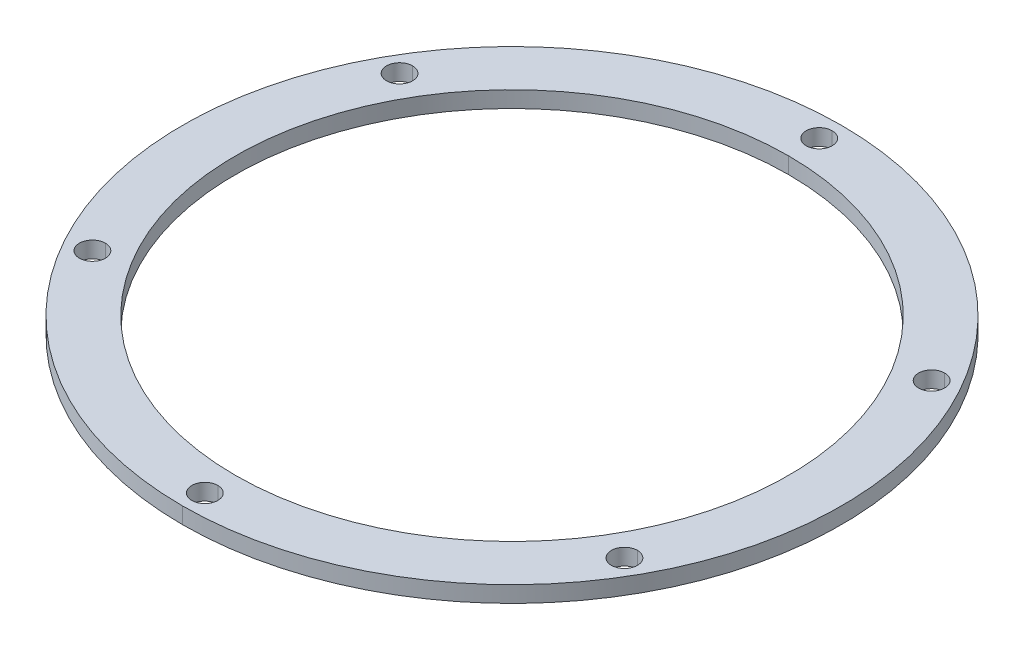
ISO-10303-21;
HEADER;
FILE_DESCRIPTION(('STEP AP214'),'2;1');
FILE_NAME('part.step','',(''),(''),'','','');
FILE_SCHEMA(('AUTOMOTIVE_DESIGN { 1 0 10303 214 1 1 1 1 }'));
ENDSEC;
DATA;
#1=APPLICATION_CONTEXT('core data for automotive mechanical design processes');
#2=APPLICATION_PROTOCOL_DEFINITION('international standard','automotive_design',2000,#1);
#3=PRODUCT_CONTEXT('',#1,'mechanical');
#4=PRODUCT('Part','Part','',(#3));
#5=PRODUCT_RELATED_PRODUCT_CATEGORY('part','',(#4));
#6=PRODUCT_DEFINITION_FORMATION('','',#4);
#7=PRODUCT_DEFINITION_CONTEXT('part definition',#1,'design');
#8=PRODUCT_DEFINITION('design','',#6,#7);
#9=PRODUCT_DEFINITION_SHAPE('','',#8);
#10=(LENGTH_UNIT() NAMED_UNIT(*) SI_UNIT(.MILLI.,.METRE.));
#11=(NAMED_UNIT(*) PLANE_ANGLE_UNIT() SI_UNIT($,.RADIAN.));
#12=(NAMED_UNIT(*) SI_UNIT($,.STERADIAN.) SOLID_ANGLE_UNIT());
#13=UNCERTAINTY_MEASURE_WITH_UNIT(LENGTH_MEASURE(1.E-05),#10,'distance_accuracy_value','');
#14=(GEOMETRIC_REPRESENTATION_CONTEXT(3) GLOBAL_UNCERTAINTY_ASSIGNED_CONTEXT((#13)) GLOBAL_UNIT_ASSIGNED_CONTEXT((#10,
#11,#12)) REPRESENTATION_CONTEXT('',''));
#15=CARTESIAN_POINT('',(0.,0.,0.));
#16=DIRECTION('',(0.,0.,1.));
#17=DIRECTION('',(1.,0.,0.));
#18=AXIS2_PLACEMENT_3D('',#15,#16,#17);
#19=CARTESIAN_POINT('',(-32.6924589928615,2.,-18.8749999999981));
#20=DIRECTION('',(0.,-1.,0.));
#21=DIRECTION('',(0.,0.,-1.));
#22=AXIS2_PLACEMENT_3D('',#19,#20,#21);
#23=CYLINDRICAL_SURFACE('',#22,1.600000000002);
#24=DIRECTION('',(0.,-1.,0.));
#25=VECTOR('',#24,1.);
#26=CARTESIAN_POINT('',(-32.6924589928615,2.,-17.2749999999961));
#27=LINE('',#26,#25);
#28=CARTESIAN_POINT('',(-32.6924589928615,2.,-17.2749999999961));
#29=VERTEX_POINT('',#28);
#30=CARTESIAN_POINT('',(-32.6924589928615,0.,-17.2749999999961));
#31=VERTEX_POINT('',#30);
#32=EDGE_CURVE('E242',#29,#31,#27,.T.);
#33=ORIENTED_EDGE('',*,*,#32,.F.);
#34=CARTESIAN_POINT('',(-32.6924589928615,2.,-18.8749999999981));
#35=DIRECTION('',(0.,1.,0.));
#36=DIRECTION('',(0.,0.,1.));
#37=AXIS2_PLACEMENT_3D('',#34,#35,#36);
#38=CIRCLE('',#37,1.600000000002);
#39=CARTESIAN_POINT('',(-32.6924589928615,2.,-20.475));
#40=VERTEX_POINT('',#39);
#41=EDGE_CURVE('E227',#29,#40,#38,.T.);
#42=ORIENTED_EDGE('',*,*,#41,.T.);
#43=DIRECTION('',(0.,-1.,0.));
#44=VECTOR('',#43,1.);
#45=CARTESIAN_POINT('',(-32.6924589928615,2.,-20.475));
#46=LINE('',#45,#44);
#47=CARTESIAN_POINT('',(-32.6924589928615,0.,-20.475));
#48=VERTEX_POINT('',#47);
#49=EDGE_CURVE('E241',#40,#48,#46,.T.);
#50=ORIENTED_EDGE('',*,*,#49,.T.);
#51=CARTESIAN_POINT('',(-32.6924589928615,0.,-18.8749999999981));
#52=DIRECTION('',(0.,1.,0.));
#53=DIRECTION('',(0.,0.,1.));
#54=AXIS2_PLACEMENT_3D('',#51,#52,#53);
#55=CIRCLE('',#54,1.600000000002);
#56=EDGE_CURVE('E11',#31,#48,#55,.T.);
#57=ORIENTED_EDGE('',*,*,#56,.F.);
#58=EDGE_LOOP('',(#33,#42,#50,#57));
#59=FACE_BOUND('',#58,.T.);
#60=ADVANCED_FACE('F16',(#59),#23,.F.);
#61=CARTESIAN_POINT('',(-32.6924589928594,2.,18.8750000000018));
#62=DIRECTION('',(0.,-1.,0.));
#63=DIRECTION('',(0.,0.,-1.));
#64=AXIS2_PLACEMENT_3D('',#61,#62,#63);
#65=CYLINDRICAL_SURFACE('',#64,1.60000000000396);
#66=DIRECTION('',(0.,-1.,0.));
#67=VECTOR('',#66,1.);
#68=CARTESIAN_POINT('',(-32.6924589928594,2.,20.4750000000058));
#69=LINE('',#68,#67);
#70=CARTESIAN_POINT('',(-32.6924589928594,2.,20.4750000000058));
#71=VERTEX_POINT('',#70);
#72=CARTESIAN_POINT('',(-32.6924589928594,0.,20.4750000000058));
#73=VERTEX_POINT('',#72);
#74=EDGE_CURVE('E293',#71,#73,#69,.T.);
#75=ORIENTED_EDGE('',*,*,#74,.F.);
#76=CARTESIAN_POINT('',(-32.6924589928594,2.,18.8750000000018));
#77=DIRECTION('',(0.,1.,0.));
#78=DIRECTION('',(0.,0.,1.));
#79=AXIS2_PLACEMENT_3D('',#76,#77,#78);
#80=CIRCLE('',#79,1.60000000000396);
#81=CARTESIAN_POINT('',(-32.6924589928594,2.,17.2749999999979));
#82=VERTEX_POINT('',#81);
#83=EDGE_CURVE('E256',#71,#82,#80,.T.);
#84=ORIENTED_EDGE('',*,*,#83,.T.);
#85=DIRECTION('',(0.,-1.,0.));
#86=VECTOR('',#85,1.);
#87=CARTESIAN_POINT('',(-32.6924589928594,2.,17.2749999999979));
#88=LINE('',#87,#86);
#89=CARTESIAN_POINT('',(-32.6924589928594,0.,17.2749999999979));
#90=VERTEX_POINT('',#89);
#91=EDGE_CURVE('E279',#82,#90,#88,.T.);
#92=ORIENTED_EDGE('',*,*,#91,.T.);
#93=CARTESIAN_POINT('',(-32.6924589928594,0.,18.8750000000018));
#94=DIRECTION('',(0.,1.,0.));
#95=DIRECTION('',(0.,0.,1.));
#96=AXIS2_PLACEMENT_3D('',#93,#94,#95);
#97=CIRCLE('',#96,1.60000000000396);
#98=EDGE_CURVE('E27',#73,#90,#97,.T.);
#99=ORIENTED_EDGE('',*,*,#98,.F.);
#100=EDGE_LOOP('',(#75,#84,#92,#99));
#101=FACE_BOUND('',#100,.T.);
#102=ADVANCED_FACE('F307',(#101),#65,.F.);
#103=CARTESIAN_POINT('',(4.27782809175881E-12,2.,37.75));
#104=DIRECTION('',(0.,-1.,0.));
#105=DIRECTION('',(0.,0.,-1.));
#106=AXIS2_PLACEMENT_3D('',#103,#104,#105);
#107=CYLINDRICAL_SURFACE('',#106,1.60000000000434);
#108=DIRECTION('',(0.,-1.,0.));
#109=VECTOR('',#108,1.);
#110=CARTESIAN_POINT('',(4.27802403524667E-12,2.,39.3500000000044));
#111=LINE('',#110,#109);
#112=CARTESIAN_POINT('',(4.27802403524667E-12,2.,39.3500000000044));
#113=VERTEX_POINT('',#112);
#114=CARTESIAN_POINT('',(4.27802403524667E-12,0.,39.3500000000044));
#115=VERTEX_POINT('',#114);
#116=EDGE_CURVE('E264',#113,#115,#111,.T.);
#117=ORIENTED_EDGE('',*,*,#116,.F.);
#118=CARTESIAN_POINT('',(4.27782809175881E-12,2.,37.75));
#119=DIRECTION('',(0.,1.,0.));
#120=DIRECTION('',(0.,0.,1.));
#121=AXIS2_PLACEMENT_3D('',#118,#119,#120);
#122=CIRCLE('',#121,1.60000000000434);
#123=CARTESIAN_POINT('',(4.27782809175881E-12,2.,36.1499999999957));
#124=VERTEX_POINT('',#123);
#125=EDGE_CURVE('E230',#113,#124,#122,.T.);
#126=ORIENTED_EDGE('',*,*,#125,.T.);
#127=DIRECTION('',(0.,-1.,0.));
#128=VECTOR('',#127,1.);
#129=CARTESIAN_POINT('',(4.27782809175881E-12,2.,36.1499999999957));
#130=LINE('',#129,#128);
#131=CARTESIAN_POINT('',(4.27782809175881E-12,0.,36.1499999999957));
#132=VERTEX_POINT('',#131);
#133=EDGE_CURVE('E201',#124,#132,#130,.T.);
#134=ORIENTED_EDGE('',*,*,#133,.T.);
#135=CARTESIAN_POINT('',(4.27782809175881E-12,0.,37.75));
#136=DIRECTION('',(0.,1.,0.));
#137=DIRECTION('',(0.,0.,1.));
#138=AXIS2_PLACEMENT_3D('',#135,#136,#137);
#139=CIRCLE('',#138,1.60000000000434);
#140=EDGE_CURVE('E234',#115,#132,#139,.T.);
#141=ORIENTED_EDGE('',*,*,#140,.F.);
#142=EDGE_LOOP('',(#117,#126,#134,#141));
#143=FACE_BOUND('',#142,.T.);
#144=ADVANCED_FACE('F394',(#143),#107,.F.);
#145=CARTESIAN_POINT('',(32.6924589928657,2.,18.8749999999981));
#146=DIRECTION('',(0.,-1.,0.));
#147=DIRECTION('',(0.,0.,-1.));
#148=AXIS2_PLACEMENT_3D('',#145,#146,#147);
#149=CYLINDRICAL_SURFACE('',#148,1.60000000000271);
#150=DIRECTION('',(0.,-1.,0.));
#151=VECTOR('',#150,1.);
#152=CARTESIAN_POINT('',(32.6924589928657,2.,20.4750000000009));
#153=LINE('',#152,#151);
#154=CARTESIAN_POINT('',(32.6924589928657,2.,20.4750000000009));
#155=VERTEX_POINT('',#154);
#156=CARTESIAN_POINT('',(32.6924589928657,0.,20.4750000000009));
#157=VERTEX_POINT('',#156);
#158=EDGE_CURVE('E245',#155,#157,#153,.T.);
#159=ORIENTED_EDGE('',*,*,#158,.F.);
#160=CARTESIAN_POINT('',(32.6924589928657,2.,18.8749999999981));
#161=DIRECTION('',(0.,1.,0.));
#162=DIRECTION('',(0.,0.,1.));
#163=AXIS2_PLACEMENT_3D('',#160,#161,#162);
#164=CIRCLE('',#163,1.60000000000271);
#165=CARTESIAN_POINT('',(32.6924589928657,2.,17.2749999999955));
#166=VERTEX_POINT('',#165);
#167=EDGE_CURVE('E259',#155,#166,#164,.T.);
#168=ORIENTED_EDGE('',*,*,#167,.T.);
#169=DIRECTION('',(0.,-1.,0.));
#170=VECTOR('',#169,1.);
#171=CARTESIAN_POINT('',(32.6924589928657,2.,17.2749999999955));
#172=LINE('',#171,#170);
#173=CARTESIAN_POINT('',(32.6924589928657,0.,17.2749999999955));
#174=VERTEX_POINT('',#173);
#175=EDGE_CURVE('E20',#166,#174,#172,.T.);
#176=ORIENTED_EDGE('',*,*,#175,.T.);
#177=CARTESIAN_POINT('',(32.6924589928657,0.,18.8749999999981));
#178=DIRECTION('',(0.,1.,0.));
#179=DIRECTION('',(0.,0.,1.));
#180=AXIS2_PLACEMENT_3D('',#177,#178,#179);
#181=CIRCLE('',#180,1.60000000000271);
#182=EDGE_CURVE('E210',#157,#174,#181,.T.);
#183=ORIENTED_EDGE('',*,*,#182,.F.);
#184=EDGE_LOOP('',(#159,#168,#176,#183));
#185=FACE_BOUND('',#184,.T.);
#186=ADVANCED_FACE('F359',(#185),#149,.F.);
#187=CARTESIAN_POINT('',(32.6924589928636,2.,-18.8750000000018));
#188=DIRECTION('',(0.,-1.,0.));
#189=DIRECTION('',(0.,0.,-1.));
#190=AXIS2_PLACEMENT_3D('',#187,#188,#189);
#191=CYLINDRICAL_SURFACE('',#190,1.60000000000058);
#192=DIRECTION('',(0.,-1.,0.));
#193=VECTOR('',#192,1.);
#194=CARTESIAN_POINT('',(32.6924589928636,2.,-17.2750000000013));
#195=LINE('',#194,#193);
#196=CARTESIAN_POINT('',(32.6924589928636,2.,-17.2750000000013));
#197=VERTEX_POINT('',#196);
#198=CARTESIAN_POINT('',(32.6924589928636,0.,-17.2750000000013));
#199=VERTEX_POINT('',#198);
#200=EDGE_CURVE('E219',#197,#199,#195,.T.);
#201=ORIENTED_EDGE('',*,*,#200,.F.);
#202=CARTESIAN_POINT('',(32.6924589928636,2.,-18.8750000000018));
#203=DIRECTION('',(0.,1.,0.));
#204=DIRECTION('',(0.,0.,1.));
#205=AXIS2_PLACEMENT_3D('',#202,#203,#204);
#206=CIRCLE('',#205,1.60000000000058);
#207=CARTESIAN_POINT('',(32.6924589928636,2.,-20.4750000000024));
#208=VERTEX_POINT('',#207);
#209=EDGE_CURVE('E173',#197,#208,#206,.T.);
#210=ORIENTED_EDGE('',*,*,#209,.T.);
#211=DIRECTION('',(0.,-1.,0.));
#212=VECTOR('',#211,1.);
#213=CARTESIAN_POINT('',(32.6924589928636,2.,-20.4750000000024));
#214=LINE('',#213,#212);
#215=CARTESIAN_POINT('',(32.6924589928636,0.,-20.4750000000024));
#216=VERTEX_POINT('',#215);
#217=EDGE_CURVE('E199',#208,#216,#214,.T.);
#218=ORIENTED_EDGE('',*,*,#217,.T.);
#219=CARTESIAN_POINT('',(32.6924589928636,0.,-18.8750000000018));
#220=DIRECTION('',(0.,1.,0.));
#221=DIRECTION('',(0.,0.,1.));
#222=AXIS2_PLACEMENT_3D('',#219,#220,#221);
#223=CIRCLE('',#222,1.60000000000058);
#224=EDGE_CURVE('E207',#199,#216,#223,.T.);
#225=ORIENTED_EDGE('',*,*,#224,.F.);
#226=EDGE_LOOP('',(#201,#210,#218,#225));
#227=FACE_BOUND('',#226,.T.);
#228=ADVANCED_FACE('F18',(#227),#191,.F.);
#229=CARTESIAN_POINT('',(0.,2.,-37.75));
#230=DIRECTION('',(0.,-1.,0.));
#231=DIRECTION('',(0.,0.,-1.));
#232=AXIS2_PLACEMENT_3D('',#229,#230,#231);
#233=CYLINDRICAL_SURFACE('',#232,1.6);
#234=DIRECTION('',(0.,-1.,0.));
#235=VECTOR('',#234,1.);
#236=CARTESIAN_POINT('',(0.,2.,-36.15));
#237=LINE('',#236,#235);
#238=CARTESIAN_POINT('',(0.,2.,-36.15));
#239=VERTEX_POINT('',#238);
#240=CARTESIAN_POINT('',(0.,0.,-36.15));
#241=VERTEX_POINT('',#240);
#242=EDGE_CURVE('E269',#239,#241,#237,.T.);
#243=ORIENTED_EDGE('',*,*,#242,.F.);
#244=CARTESIAN_POINT('',(0.,2.,-37.75));
#245=DIRECTION('',(0.,1.,0.));
#246=DIRECTION('',(0.,0.,1.));
#247=AXIS2_PLACEMENT_3D('',#244,#245,#246);
#248=CIRCLE('',#247,1.6);
#249=CARTESIAN_POINT('',(0.,2.,-39.35));
#250=VERTEX_POINT('',#249);
#251=EDGE_CURVE('E174',#239,#250,#248,.T.);
#252=ORIENTED_EDGE('',*,*,#251,.T.);
#253=DIRECTION('',(0.,-1.,0.));
#254=VECTOR('',#253,1.);
#255=CARTESIAN_POINT('',(0.,2.,-39.35));
#256=LINE('',#255,#254);
#257=CARTESIAN_POINT('',(0.,0.,-39.35));
#258=VERTEX_POINT('',#257);
#259=EDGE_CURVE('E187',#250,#258,#256,.T.);
#260=ORIENTED_EDGE('',*,*,#259,.T.);
#261=CARTESIAN_POINT('',(0.,0.,-37.75));
#262=DIRECTION('',(0.,1.,0.));
#263=DIRECTION('',(0.,0.,1.));
#264=AXIS2_PLACEMENT_3D('',#261,#262,#263);
#265=CIRCLE('',#264,1.6);
#266=EDGE_CURVE('E211',#241,#258,#265,.T.);
#267=ORIENTED_EDGE('',*,*,#266,.F.);
#268=EDGE_LOOP('',(#243,#252,#260,#267));
#269=FACE_BOUND('',#268,.T.);
#270=ADVANCED_FACE('F404',(#269),#233,.F.);
#271=CARTESIAN_POINT('',(0.,2.,0.));
#272=DIRECTION('',(0.,-1.,0.));
#273=DIRECTION('',(0.,0.,-1.));
#274=AXIS2_PLACEMENT_3D('',#271,#272,#273);
#275=CYLINDRICAL_SURFACE('',#274,34.);
#276=DIRECTION('',(0.,-1.,0.));
#277=VECTOR('',#276,1.);
#278=CARTESIAN_POINT('',(0.,2.,34.));
#279=LINE('',#278,#277);
#280=CARTESIAN_POINT('',(0.,2.,34.));
#281=VERTEX_POINT('',#280);
#282=CARTESIAN_POINT('',(0.,0.,34.));
#283=VERTEX_POINT('',#282);
#284=EDGE_CURVE('E168',#281,#283,#279,.T.);
#285=ORIENTED_EDGE('',*,*,#284,.F.);
#286=CARTESIAN_POINT('',(0.,2.,0.));
#287=DIRECTION('',(0.,1.,0.));
#288=DIRECTION('',(0.,0.,1.));
#289=AXIS2_PLACEMENT_3D('',#286,#287,#288);
#290=CIRCLE('',#289,34.);
#291=CARTESIAN_POINT('',(0.,2.,-34.));
#292=VERTEX_POINT('',#291);
#293=EDGE_CURVE('E162',#281,#292,#290,.T.);
#294=ORIENTED_EDGE('',*,*,#293,.T.);
#295=DIRECTION('',(0.,-1.,0.));
#296=VECTOR('',#295,1.);
#297=CARTESIAN_POINT('',(0.,2.,-34.));
#298=LINE('',#297,#296);
#299=CARTESIAN_POINT('',(0.,0.,-34.));
#300=VERTEX_POINT('',#299);
#301=EDGE_CURVE('E165',#292,#300,#298,.T.);
#302=ORIENTED_EDGE('',*,*,#301,.T.);
#303=CARTESIAN_POINT('',(0.,0.,0.));
#304=DIRECTION('',(0.,1.,0.));
#305=DIRECTION('',(0.,0.,1.));
#306=AXIS2_PLACEMENT_3D('',#303,#304,#305);
#307=CIRCLE('',#306,34.);
#308=EDGE_CURVE('E218',#283,#300,#307,.T.);
#309=ORIENTED_EDGE('',*,*,#308,.F.);
#310=EDGE_LOOP('',(#285,#294,#302,#309));
#311=FACE_BOUND('',#310,.T.);
#312=ADVANCED_FACE('F164',(#311),#275,.F.);
#313=CARTESIAN_POINT('',(0.,2.,0.));
#314=DIRECTION('',(0.,-1.,0.));
#315=DIRECTION('',(0.,0.,-1.));
#316=AXIS2_PLACEMENT_3D('',#313,#314,#315);
#317=CYLINDRICAL_SURFACE('',#316,40.5);
#318=DIRECTION('',(0.,-1.,0.));
#319=VECTOR('',#318,1.);
#320=CARTESIAN_POINT('',(0.,2.,40.5));
#321=LINE('',#320,#319);
#322=CARTESIAN_POINT('',(0.,2.,40.5));
#323=VERTEX_POINT('',#322);
#324=CARTESIAN_POINT('',(0.,0.,40.5));
#325=VERTEX_POINT('',#324);
#326=EDGE_CURVE('E215',#323,#325,#321,.T.);
#327=ORIENTED_EDGE('',*,*,#326,.F.);
#328=CARTESIAN_POINT('',(0.,2.,0.));
#329=DIRECTION('',(0.,1.,0.));
#330=DIRECTION('',(0.,0.,1.));
#331=AXIS2_PLACEMENT_3D('',#328,#329,#330);
#332=CIRCLE('',#331,40.5);
#333=CARTESIAN_POINT('',(0.,2.,-40.5));
#334=VERTEX_POINT('',#333);
#335=EDGE_CURVE('E260',#334,#323,#332,.T.);
#336=ORIENTED_EDGE('',*,*,#335,.F.);
#337=DIRECTION('',(0.,-1.,0.));
#338=VECTOR('',#337,1.);
#339=CARTESIAN_POINT('',(0.,2.,-40.5));
#340=LINE('',#339,#338);
#341=CARTESIAN_POINT('',(0.,0.,-40.5));
#342=VERTEX_POINT('',#341);
#343=EDGE_CURVE('E251',#334,#342,#340,.T.);
#344=ORIENTED_EDGE('',*,*,#343,.T.);
#345=CARTESIAN_POINT('',(0.,0.,0.));
#346=DIRECTION('',(0.,1.,0.));
#347=DIRECTION('',(0.,0.,1.));
#348=AXIS2_PLACEMENT_3D('',#345,#346,#347);
#349=CIRCLE('',#348,40.5);
#350=EDGE_CURVE('E41',#342,#325,#349,.T.);
#351=ORIENTED_EDGE('',*,*,#350,.T.);
#352=EDGE_LOOP('',(#327,#336,#344,#351));
#353=FACE_BOUND('',#352,.T.);
#354=ADVANCED_FACE('F374',(#353),#317,.T.);
#355=CARTESIAN_POINT('',(0.,0.,0.));
#356=DIRECTION('',(0.,1.,0.));
#357=DIRECTION('',(1.,0.,0.));
#358=AXIS2_PLACEMENT_3D('',#355,#356,#357);
#359=PLANE('',#358);
#360=CARTESIAN_POINT('',(-32.6924589928615,0.,-18.8749999999981));
#361=DIRECTION('',(0.,1.,0.));
#362=DIRECTION('',(0.,0.,1.));
#363=AXIS2_PLACEMENT_3D('',#360,#361,#362);
#364=CIRCLE('',#363,1.600000000002);
#365=EDGE_CURVE('E237',#48,#31,#364,.T.);
#366=ORIENTED_EDGE('',*,*,#365,.T.);
#367=ORIENTED_EDGE('',*,*,#56,.T.);
#368=EDGE_LOOP('',(#366,#367));
#369=FACE_BOUND('',#368,.T.);
#370=CARTESIAN_POINT('',(-32.6924589928594,0.,18.8750000000018));
#371=DIRECTION('',(0.,1.,0.));
#372=DIRECTION('',(0.,0.,1.));
#373=AXIS2_PLACEMENT_3D('',#370,#371,#372);
#374=CIRCLE('',#373,1.60000000000396);
#375=EDGE_CURVE('E289',#90,#73,#374,.T.);
#376=ORIENTED_EDGE('',*,*,#375,.T.);
#377=ORIENTED_EDGE('',*,*,#98,.T.);
#378=EDGE_LOOP('',(#376,#377));
#379=FACE_BOUND('',#378,.T.);
#380=CARTESIAN_POINT('',(4.27782809175881E-12,0.,37.75));
#381=DIRECTION('',(0.,1.,0.));
#382=DIRECTION('',(0.,0.,1.));
#383=AXIS2_PLACEMENT_3D('',#380,#381,#382);
#384=CIRCLE('',#383,1.60000000000434);
#385=EDGE_CURVE('E205',#132,#115,#384,.T.);
#386=ORIENTED_EDGE('',*,*,#385,.T.);
#387=ORIENTED_EDGE('',*,*,#140,.T.);
#388=EDGE_LOOP('',(#386,#387));
#389=FACE_BOUND('',#388,.T.);
#390=CARTESIAN_POINT('',(32.6924589928657,0.,18.8749999999981));
#391=DIRECTION('',(0.,1.,0.));
#392=DIRECTION('',(0.,0.,1.));
#393=AXIS2_PLACEMENT_3D('',#390,#391,#392);
#394=CIRCLE('',#393,1.60000000000271);
#395=EDGE_CURVE('E332',#174,#157,#394,.T.);
#396=ORIENTED_EDGE('',*,*,#395,.T.);
#397=ORIENTED_EDGE('',*,*,#182,.T.);
#398=EDGE_LOOP('',(#396,#397));
#399=FACE_BOUND('',#398,.T.);
#400=CARTESIAN_POINT('',(32.6924589928636,0.,-18.8750000000018));
#401=DIRECTION('',(0.,1.,0.));
#402=DIRECTION('',(0.,0.,1.));
#403=AXIS2_PLACEMENT_3D('',#400,#401,#402);
#404=CIRCLE('',#403,1.60000000000058);
#405=EDGE_CURVE('E222',#216,#199,#404,.T.);
#406=ORIENTED_EDGE('',*,*,#405,.T.);
#407=ORIENTED_EDGE('',*,*,#224,.T.);
#408=EDGE_LOOP('',(#406,#407));
#409=FACE_BOUND('',#408,.T.);
#410=CARTESIAN_POINT('',(0.,0.,-37.75));
#411=DIRECTION('',(0.,1.,0.));
#412=DIRECTION('',(0.,0.,1.));
#413=AXIS2_PLACEMENT_3D('',#410,#411,#412);
#414=CIRCLE('',#413,1.6);
#415=EDGE_CURVE('E195',#258,#241,#414,.T.);
#416=ORIENTED_EDGE('',*,*,#415,.T.);
#417=ORIENTED_EDGE('',*,*,#266,.T.);
#418=EDGE_LOOP('',(#416,#417));
#419=FACE_BOUND('',#418,.T.);
#420=CARTESIAN_POINT('',(0.,0.,0.));
#421=DIRECTION('',(0.,1.,0.));
#422=DIRECTION('',(0.,0.,1.));
#423=AXIS2_PLACEMENT_3D('',#420,#421,#422);
#424=CIRCLE('',#423,34.);
#425=EDGE_CURVE('E180',#300,#283,#424,.T.);
#426=ORIENTED_EDGE('',*,*,#425,.T.);
#427=ORIENTED_EDGE('',*,*,#308,.T.);
#428=EDGE_LOOP('',(#426,#427));
#429=FACE_BOUND('',#428,.T.);
#430=ORIENTED_EDGE('',*,*,#350,.F.);
#431=CARTESIAN_POINT('',(0.,0.,0.));
#432=DIRECTION('',(0.,1.,0.));
#433=DIRECTION('',(0.,0.,1.));
#434=AXIS2_PLACEMENT_3D('',#431,#432,#433);
#435=CIRCLE('',#434,40.5);
#436=EDGE_CURVE('E247',#325,#342,#435,.T.);
#437=ORIENTED_EDGE('',*,*,#436,.F.);
#438=EDGE_LOOP('',(#430,#437));
#439=FACE_BOUND('',#438,.T.);
#440=ADVANCED_FACE('F300',(#369,#379,#389,#399,#409,#419,#429,#439),#359,.F.);
#441=CARTESIAN_POINT('',(0.,2.,0.));
#442=DIRECTION('',(0.,1.,0.));
#443=DIRECTION('',(1.,0.,0.));
#444=AXIS2_PLACEMENT_3D('',#441,#442,#443);
#445=PLANE('',#444);
#446=CARTESIAN_POINT('',(-32.6924589928615,2.,-18.8749999999981));
#447=DIRECTION('',(0.,1.,0.));
#448=DIRECTION('',(0.,0.,1.));
#449=AXIS2_PLACEMENT_3D('',#446,#447,#448);
#450=CIRCLE('',#449,1.600000000002);
#451=EDGE_CURVE('E324',#40,#29,#450,.T.);
#452=ORIENTED_EDGE('',*,*,#451,.F.);
#453=ORIENTED_EDGE('',*,*,#41,.F.);
#454=EDGE_LOOP('',(#452,#453));
#455=FACE_BOUND('',#454,.T.);
#456=CARTESIAN_POINT('',(4.27782809175881E-12,2.,37.75));
#457=DIRECTION('',(0.,1.,0.));
#458=DIRECTION('',(0.,0.,1.));
#459=AXIS2_PLACEMENT_3D('',#456,#457,#458);
#460=CIRCLE('',#459,1.60000000000434);
#461=EDGE_CURVE('E268',#124,#113,#460,.T.);
#462=ORIENTED_EDGE('',*,*,#461,.F.);
#463=ORIENTED_EDGE('',*,*,#125,.F.);
#464=EDGE_LOOP('',(#462,#463));
#465=FACE_BOUND('',#464,.T.);
#466=CARTESIAN_POINT('',(32.6924589928636,2.,-18.8750000000018));
#467=DIRECTION('',(0.,1.,0.));
#468=DIRECTION('',(0.,0.,1.));
#469=AXIS2_PLACEMENT_3D('',#466,#467,#468);
#470=CIRCLE('',#469,1.60000000000058);
#471=EDGE_CURVE('E223',#208,#197,#470,.T.);
#472=ORIENTED_EDGE('',*,*,#471,.F.);
#473=ORIENTED_EDGE('',*,*,#209,.F.);
#474=EDGE_LOOP('',(#472,#473));
#475=FACE_BOUND('',#474,.T.);
#476=CARTESIAN_POINT('',(0.,2.,0.));
#477=DIRECTION('',(0.,1.,0.));
#478=DIRECTION('',(0.,0.,1.));
#479=AXIS2_PLACEMENT_3D('',#476,#477,#478);
#480=CIRCLE('',#479,34.);
#481=EDGE_CURVE('E178',#292,#281,#480,.T.);
#482=ORIENTED_EDGE('',*,*,#481,.F.);
#483=ORIENTED_EDGE('',*,*,#293,.F.);
#484=EDGE_LOOP('',(#482,#483));
#485=FACE_BOUND('',#484,.T.);
#486=CARTESIAN_POINT('',(0.,2.,-37.75));
#487=DIRECTION('',(0.,1.,0.));
#488=DIRECTION('',(0.,0.,1.));
#489=AXIS2_PLACEMENT_3D('',#486,#487,#488);
#490=CIRCLE('',#489,1.6);
#491=EDGE_CURVE('E273',#250,#239,#490,.T.);
#492=ORIENTED_EDGE('',*,*,#491,.F.);
#493=ORIENTED_EDGE('',*,*,#251,.F.);
#494=EDGE_LOOP('',(#492,#493));
#495=FACE_BOUND('',#494,.T.);
#496=CARTESIAN_POINT('',(32.6924589928657,2.,18.8749999999981));
#497=DIRECTION('',(0.,1.,0.));
#498=DIRECTION('',(0.,0.,1.));
#499=AXIS2_PLACEMENT_3D('',#496,#497,#498);
#500=CIRCLE('',#499,1.60000000000271);
#501=EDGE_CURVE('E204',#166,#155,#500,.T.);
#502=ORIENTED_EDGE('',*,*,#501,.F.);
#503=ORIENTED_EDGE('',*,*,#167,.F.);
#504=EDGE_LOOP('',(#502,#503));
#505=FACE_BOUND('',#504,.T.);
#506=CARTESIAN_POINT('',(-32.6924589928594,2.,18.8750000000018));
#507=DIRECTION('',(0.,1.,0.));
#508=DIRECTION('',(0.,0.,1.));
#509=AXIS2_PLACEMENT_3D('',#506,#507,#508);
#510=CIRCLE('',#509,1.60000000000396);
#511=EDGE_CURVE('E255',#82,#71,#510,.T.);
#512=ORIENTED_EDGE('',*,*,#511,.F.);
#513=ORIENTED_EDGE('',*,*,#83,.F.);
#514=EDGE_LOOP('',(#512,#513));
#515=FACE_BOUND('',#514,.T.);
#516=ORIENTED_EDGE('',*,*,#335,.T.);
#517=CARTESIAN_POINT('',(0.,2.,0.));
#518=DIRECTION('',(0.,1.,0.));
#519=DIRECTION('',(0.,0.,1.));
#520=AXIS2_PLACEMENT_3D('',#517,#518,#519);
#521=CIRCLE('',#520,40.5);
#522=EDGE_CURVE('E182',#323,#334,#521,.T.);
#523=ORIENTED_EDGE('',*,*,#522,.T.);
#524=EDGE_LOOP('',(#516,#523));
#525=FACE_BOUND('',#524,.T.);
#526=ADVANCED_FACE('F184',(#455,#465,#475,#485,#495,#505,#515,#525),#445,.T.);
#527=CARTESIAN_POINT('',(0.,2.,0.));
#528=DIRECTION('',(0.,-1.,0.));
#529=DIRECTION('',(0.,0.,-1.));
#530=AXIS2_PLACEMENT_3D('',#527,#528,#529);
#531=CYLINDRICAL_SURFACE('',#530,40.5);
#532=ORIENTED_EDGE('',*,*,#522,.F.);
#533=ORIENTED_EDGE('',*,*,#326,.T.);
#534=ORIENTED_EDGE('',*,*,#436,.T.);
#535=ORIENTED_EDGE('',*,*,#343,.F.);
#536=EDGE_LOOP('',(#532,#533,#534,#535));
#537=FACE_BOUND('',#536,.T.);
#538=ADVANCED_FACE('F366',(#537),#531,.T.);
#539=CARTESIAN_POINT('',(0.,2.,0.));
#540=DIRECTION('',(0.,-1.,0.));
#541=DIRECTION('',(0.,0.,-1.));
#542=AXIS2_PLACEMENT_3D('',#539,#540,#541);
#543=CYLINDRICAL_SURFACE('',#542,34.);
#544=ORIENTED_EDGE('',*,*,#481,.T.);
#545=ORIENTED_EDGE('',*,*,#284,.T.);
#546=ORIENTED_EDGE('',*,*,#425,.F.);
#547=ORIENTED_EDGE('',*,*,#301,.F.);
#548=EDGE_LOOP('',(#544,#545,#546,#547));
#549=FACE_BOUND('',#548,.T.);
#550=ADVANCED_FACE('F177',(#549),#543,.F.);
#551=CARTESIAN_POINT('',(0.,2.,-37.75));
#552=DIRECTION('',(0.,-1.,0.));
#553=DIRECTION('',(0.,0.,-1.));
#554=AXIS2_PLACEMENT_3D('',#551,#552,#553);
#555=CYLINDRICAL_SURFACE('',#554,1.6);
#556=ORIENTED_EDGE('',*,*,#491,.T.);
#557=ORIENTED_EDGE('',*,*,#242,.T.);
#558=ORIENTED_EDGE('',*,*,#415,.F.);
#559=ORIENTED_EDGE('',*,*,#259,.F.);
#560=EDGE_LOOP('',(#556,#557,#558,#559));
#561=FACE_BOUND('',#560,.T.);
#562=ADVANCED_FACE('F401',(#561),#555,.F.);
#563=CARTESIAN_POINT('',(32.6924589928636,2.,-18.8750000000018));
#564=DIRECTION('',(0.,-1.,0.));
#565=DIRECTION('',(0.,0.,-1.));
#566=AXIS2_PLACEMENT_3D('',#563,#564,#565);
#567=CYLINDRICAL_SURFACE('',#566,1.60000000000058);
#568=ORIENTED_EDGE('',*,*,#471,.T.);
#569=ORIENTED_EDGE('',*,*,#200,.T.);
#570=ORIENTED_EDGE('',*,*,#405,.F.);
#571=ORIENTED_EDGE('',*,*,#217,.F.);
#572=EDGE_LOOP('',(#568,#569,#570,#571));
#573=FACE_BOUND('',#572,.T.);
#574=ADVANCED_FACE('F399',(#573),#567,.F.);
#575=CARTESIAN_POINT('',(32.6924589928657,2.,18.8749999999981));
#576=DIRECTION('',(0.,-1.,0.));
#577=DIRECTION('',(0.,0.,-1.));
#578=AXIS2_PLACEMENT_3D('',#575,#576,#577);
#579=CYLINDRICAL_SURFACE('',#578,1.60000000000271);
#580=ORIENTED_EDGE('',*,*,#501,.T.);
#581=ORIENTED_EDGE('',*,*,#158,.T.);
#582=ORIENTED_EDGE('',*,*,#395,.F.);
#583=ORIENTED_EDGE('',*,*,#175,.F.);
#584=EDGE_LOOP('',(#580,#581,#582,#583));
#585=FACE_BOUND('',#584,.T.);
#586=ADVANCED_FACE('F362',(#585),#579,.F.);
#587=CARTESIAN_POINT('',(4.27782809175881E-12,2.,37.75));
#588=DIRECTION('',(0.,-1.,0.));
#589=DIRECTION('',(0.,0.,-1.));
#590=AXIS2_PLACEMENT_3D('',#587,#588,#589);
#591=CYLINDRICAL_SURFACE('',#590,1.60000000000434);
#592=ORIENTED_EDGE('',*,*,#461,.T.);
#593=ORIENTED_EDGE('',*,*,#116,.T.);
#594=ORIENTED_EDGE('',*,*,#385,.F.);
#595=ORIENTED_EDGE('',*,*,#133,.F.);
#596=EDGE_LOOP('',(#592,#593,#594,#595));
#597=FACE_BOUND('',#596,.T.);
#598=ADVANCED_FACE('F423',(#597),#591,.F.);
#599=CARTESIAN_POINT('',(-32.6924589928594,2.,18.8750000000018));
#600=DIRECTION('',(0.,-1.,0.));
#601=DIRECTION('',(0.,0.,-1.));
#602=AXIS2_PLACEMENT_3D('',#599,#600,#601);
#603=CYLINDRICAL_SURFACE('',#602,1.60000000000396);
#604=ORIENTED_EDGE('',*,*,#511,.T.);
#605=ORIENTED_EDGE('',*,*,#74,.T.);
#606=ORIENTED_EDGE('',*,*,#375,.F.);
#607=ORIENTED_EDGE('',*,*,#91,.F.);
#608=EDGE_LOOP('',(#604,#605,#606,#607));
#609=FACE_BOUND('',#608,.T.);
#610=ADVANCED_FACE('F313',(#609),#603,.F.);
#611=CARTESIAN_POINT('',(-32.6924589928615,2.,-18.8749999999981));
#612=DIRECTION('',(0.,-1.,0.));
#613=DIRECTION('',(0.,0.,-1.));
#614=AXIS2_PLACEMENT_3D('',#611,#612,#613);
#615=CYLINDRICAL_SURFACE('',#614,1.600000000002);
#616=ORIENTED_EDGE('',*,*,#451,.T.);
#617=ORIENTED_EDGE('',*,*,#32,.T.);
#618=ORIENTED_EDGE('',*,*,#365,.F.);
#619=ORIENTED_EDGE('',*,*,#49,.F.);
#620=EDGE_LOOP('',(#616,#617,#618,#619));
#621=FACE_BOUND('',#620,.T.);
#622=ADVANCED_FACE('F417',(#621),#615,.F.);
#623=CLOSED_SHELL('',(#60,#102,#144,#186,#228,#270,#312,#354,#440,#526,#538,#550,#562,#574,#586,
#598,#610,#622));
#624=MANIFOLD_SOLID_BREP('B1',#623);
#625=ADVANCED_BREP_SHAPE_REPRESENTATION('',(#18,#624),#14);
#626=SHAPE_DEFINITION_REPRESENTATION(#9,#625);
ENDSEC;
END-ISO-10303-21;
